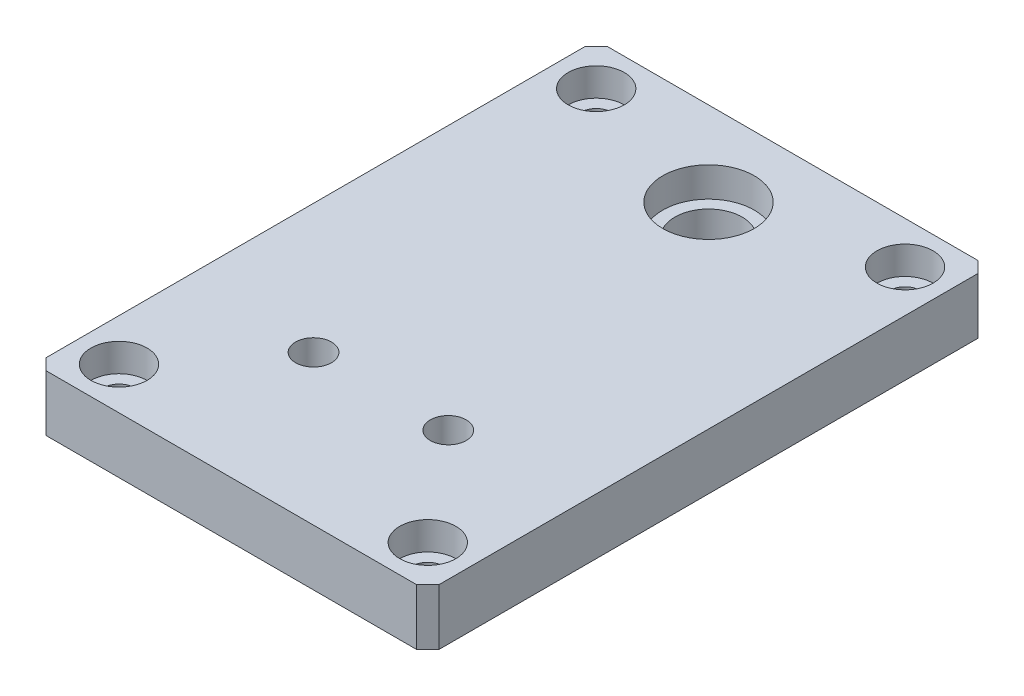
ISO-10303-21;
HEADER;
FILE_DESCRIPTION(('STEP AP214'),'2;1');
FILE_NAME('part.step','',(''),(''),'','','');
FILE_SCHEMA(('AUTOMOTIVE_DESIGN { 1 0 10303 214 1 1 1 1 }'));
ENDSEC;
DATA;
#1=APPLICATION_CONTEXT('core data for automotive mechanical design processes');
#2=APPLICATION_PROTOCOL_DEFINITION('international standard','automotive_design',2000,#1);
#3=PRODUCT_CONTEXT('',#1,'mechanical');
#4=PRODUCT('Part','Part','',(#3));
#5=PRODUCT_RELATED_PRODUCT_CATEGORY('part','',(#4));
#6=PRODUCT_DEFINITION_FORMATION('','',#4);
#7=PRODUCT_DEFINITION_CONTEXT('part definition',#1,'design');
#8=PRODUCT_DEFINITION('design','',#6,#7);
#9=PRODUCT_DEFINITION_SHAPE('','',#8);
#10=(LENGTH_UNIT() NAMED_UNIT(*) SI_UNIT(.MILLI.,.METRE.));
#11=(NAMED_UNIT(*) PLANE_ANGLE_UNIT() SI_UNIT($,.RADIAN.));
#12=(NAMED_UNIT(*) SI_UNIT($,.STERADIAN.) SOLID_ANGLE_UNIT());
#13=UNCERTAINTY_MEASURE_WITH_UNIT(LENGTH_MEASURE(1.E-05),#10,'distance_accuracy_value','');
#14=(GEOMETRIC_REPRESENTATION_CONTEXT(3) GLOBAL_UNCERTAINTY_ASSIGNED_CONTEXT((#13)) GLOBAL_UNIT_ASSIGNED_CONTEXT((#10,
#11,#12)) REPRESENTATION_CONTEXT('',''));
#15=CARTESIAN_POINT('',(0.,0.,0.));
#16=DIRECTION('',(0.,0.,1.));
#17=DIRECTION('',(1.,0.,0.));
#18=AXIS2_PLACEMENT_3D('',#15,#16,#17);
#19=CARTESIAN_POINT('',(35.,10.,50.));
#20=DIRECTION('',(-1.,0.,0.));
#21=DIRECTION('',(0.,0.,1.));
#22=AXIS2_PLACEMENT_3D('',#19,#20,#21);
#23=PLANE('',#22);
#24=DIRECTION('',(0.,0.,-1.));
#25=VECTOR('',#24,1.);
#26=CARTESIAN_POINT('',(35.,10.,50.));
#27=LINE('',#26,#25);
#28=CARTESIAN_POINT('',(35.,10.,48.));
#29=VERTEX_POINT('',#28);
#30=CARTESIAN_POINT('',(35.,10.,-48.));
#31=VERTEX_POINT('',#30);
#32=EDGE_CURVE('E131',#29,#31,#27,.T.);
#33=ORIENTED_EDGE('',*,*,#32,.F.);
#34=DIRECTION('',(0.,-1.,0.));
#35=VECTOR('',#34,1.);
#36=CARTESIAN_POINT('',(35.,10.,48.));
#37=LINE('',#36,#35);
#38=CARTESIAN_POINT('',(35.,0.,48.));
#39=VERTEX_POINT('',#38);
#40=EDGE_CURVE('E116',#29,#39,#37,.T.);
#41=ORIENTED_EDGE('',*,*,#40,.T.);
#42=DIRECTION('',(0.,0.,-1.));
#43=VECTOR('',#42,1.);
#44=CARTESIAN_POINT('',(35.,0.,50.));
#45=LINE('',#44,#43);
#46=CARTESIAN_POINT('',(35.,0.,-48.));
#47=VERTEX_POINT('',#46);
#48=EDGE_CURVE('E128',#39,#47,#45,.T.);
#49=ORIENTED_EDGE('',*,*,#48,.T.);
#50=DIRECTION('',(0.,1.,0.));
#51=VECTOR('',#50,1.);
#52=CARTESIAN_POINT('',(35.,10.,-48.));
#53=LINE('',#52,#51);
#54=EDGE_CURVE('E133',#47,#31,#53,.T.);
#55=ORIENTED_EDGE('',*,*,#54,.T.);
#56=EDGE_LOOP('',(#33,#41,#49,#55));
#57=FACE_BOUND('',#56,.T.);
#58=ADVANCED_FACE('F45',(#57),#23,.F.);
#59=CARTESIAN_POINT('',(-35.,10.,-50.));
#60=DIRECTION('',(0.,0.,1.));
#61=DIRECTION('',(1.,0.,0.));
#62=AXIS2_PLACEMENT_3D('',#59,#60,#61);
#63=PLANE('',#62);
#64=DIRECTION('',(-1.,0.,0.));
#65=VECTOR('',#64,1.);
#66=CARTESIAN_POINT('',(-35.,10.,-50.));
#67=LINE('',#66,#65);
#68=CARTESIAN_POINT('',(33.,10.,-50.));
#69=VERTEX_POINT('',#68);
#70=CARTESIAN_POINT('',(-33.,10.,-50.));
#71=VERTEX_POINT('',#70);
#72=EDGE_CURVE('E177',#69,#71,#67,.T.);
#73=ORIENTED_EDGE('',*,*,#72,.F.);
#74=DIRECTION('',(0.,-1.,0.));
#75=VECTOR('',#74,1.);
#76=CARTESIAN_POINT('',(33.,10.,-50.));
#77=LINE('',#76,#75);
#78=CARTESIAN_POINT('',(33.,0.,-50.));
#79=VERTEX_POINT('',#78);
#80=EDGE_CURVE('E170',#69,#79,#77,.T.);
#81=ORIENTED_EDGE('',*,*,#80,.T.);
#82=DIRECTION('',(-1.,0.,0.));
#83=VECTOR('',#82,1.);
#84=CARTESIAN_POINT('',(-35.,0.,-50.));
#85=LINE('',#84,#83);
#86=CARTESIAN_POINT('',(-33.,0.,-50.));
#87=VERTEX_POINT('',#86);
#88=EDGE_CURVE('E137',#79,#87,#85,.T.);
#89=ORIENTED_EDGE('',*,*,#88,.T.);
#90=DIRECTION('',(0.,1.,0.));
#91=VECTOR('',#90,1.);
#92=CARTESIAN_POINT('',(-33.,10.,-50.));
#93=LINE('',#92,#91);
#94=EDGE_CURVE('E168',#87,#71,#93,.T.);
#95=ORIENTED_EDGE('',*,*,#94,.T.);
#96=EDGE_LOOP('',(#73,#81,#89,#95));
#97=FACE_BOUND('',#96,.T.);
#98=ADVANCED_FACE('F175',(#97),#63,.F.);
#99=CARTESIAN_POINT('',(-35.,10.,50.));
#100=DIRECTION('',(1.,0.,0.));
#101=DIRECTION('',(0.,0.,-1.));
#102=AXIS2_PLACEMENT_3D('',#99,#100,#101);
#103=PLANE('',#102);
#104=DIRECTION('',(0.,0.,1.));
#105=VECTOR('',#104,1.);
#106=CARTESIAN_POINT('',(-35.,10.,50.));
#107=LINE('',#106,#105);
#108=CARTESIAN_POINT('',(-35.,10.,-48.));
#109=VERTEX_POINT('',#108);
#110=CARTESIAN_POINT('',(-35.,10.,48.));
#111=VERTEX_POINT('',#110);
#112=EDGE_CURVE('E185',#109,#111,#107,.T.);
#113=ORIENTED_EDGE('',*,*,#112,.F.);
#114=DIRECTION('',(0.,-1.,0.));
#115=VECTOR('',#114,1.);
#116=CARTESIAN_POINT('',(-35.,10.,-48.));
#117=LINE('',#116,#115);
#118=CARTESIAN_POINT('',(-35.,0.,-48.));
#119=VERTEX_POINT('',#118);
#120=EDGE_CURVE('E11',#109,#119,#117,.T.);
#121=ORIENTED_EDGE('',*,*,#120,.T.);
#122=DIRECTION('',(0.,0.,1.));
#123=VECTOR('',#122,1.);
#124=CARTESIAN_POINT('',(-35.,0.,50.));
#125=LINE('',#124,#123);
#126=CARTESIAN_POINT('',(-35.,0.,48.));
#127=VERTEX_POINT('',#126);
#128=EDGE_CURVE('E141',#119,#127,#125,.T.);
#129=ORIENTED_EDGE('',*,*,#128,.T.);
#130=DIRECTION('',(0.,1.,0.));
#131=VECTOR('',#130,1.);
#132=CARTESIAN_POINT('',(-35.,10.,48.));
#133=LINE('',#132,#131);
#134=EDGE_CURVE('E54',#127,#111,#133,.T.);
#135=ORIENTED_EDGE('',*,*,#134,.T.);
#136=EDGE_LOOP('',(#113,#121,#129,#135));
#137=FACE_BOUND('',#136,.T.);
#138=ADVANCED_FACE('F184',(#137),#103,.F.);
#139=CARTESIAN_POINT('',(-35.,10.,50.));
#140=DIRECTION('',(0.,0.,-1.));
#141=DIRECTION('',(-1.,0.,0.));
#142=AXIS2_PLACEMENT_3D('',#139,#140,#141);
#143=PLANE('',#142);
#144=DIRECTION('',(1.,0.,0.));
#145=VECTOR('',#144,1.);
#146=CARTESIAN_POINT('',(-35.,0.,50.));
#147=LINE('',#146,#145);
#148=CARTESIAN_POINT('',(-33.,0.,50.));
#149=VERTEX_POINT('',#148);
#150=CARTESIAN_POINT('',(33.,0.,50.));
#151=VERTEX_POINT('',#150);
#152=EDGE_CURVE('E151',#149,#151,#147,.T.);
#153=ORIENTED_EDGE('',*,*,#152,.T.);
#154=DIRECTION('',(0.,1.,0.));
#155=VECTOR('',#154,1.);
#156=CARTESIAN_POINT('',(33.,10.,50.));
#157=LINE('',#156,#155);
#158=CARTESIAN_POINT('',(33.,10.,50.));
#159=VERTEX_POINT('',#158);
#160=EDGE_CURVE('E117',#151,#159,#157,.T.);
#161=ORIENTED_EDGE('',*,*,#160,.T.);
#162=DIRECTION('',(1.,0.,0.));
#163=VECTOR('',#162,1.);
#164=CARTESIAN_POINT('',(-35.,10.,50.));
#165=LINE('',#164,#163);
#166=CARTESIAN_POINT('',(-33.,10.,50.));
#167=VERTEX_POINT('',#166);
#168=EDGE_CURVE('E147',#167,#159,#165,.T.);
#169=ORIENTED_EDGE('',*,*,#168,.F.);
#170=DIRECTION('',(0.,-1.,0.));
#171=VECTOR('',#170,1.);
#172=CARTESIAN_POINT('',(-33.,10.,50.));
#173=LINE('',#172,#171);
#174=EDGE_CURVE('E122',#167,#149,#173,.T.);
#175=ORIENTED_EDGE('',*,*,#174,.T.);
#176=EDGE_LOOP('',(#153,#161,#169,#175));
#177=FACE_BOUND('',#176,.T.);
#178=ADVANCED_FACE('F272',(#177),#143,.F.);
#179=CARTESIAN_POINT('',(0.,10.,0.));
#180=DIRECTION('',(0.,-1.,0.));
#181=DIRECTION('',(0.,0.,-1.));
#182=AXIS2_PLACEMENT_3D('',#179,#180,#181);
#183=PLANE('',#182);
#184=CARTESIAN_POINT('',(12.,10.,23.35));
#185=DIRECTION('',(0.,1.,0.));
#186=DIRECTION('',(0.,0.,1.));
#187=AXIS2_PLACEMENT_3D('',#184,#185,#186);
#188=CIRCLE('',#187,3.2);
#189=CARTESIAN_POINT('',(12.,10.,26.55));
#190=VERTEX_POINT('',#189);
#191=EDGE_CURVE('E254',#190,#190,#188,.T.);
#192=ORIENTED_EDGE('',*,*,#191,.F.);
#193=EDGE_LOOP('',(#192));
#194=FACE_BOUND('',#193,.T.);
#195=CARTESIAN_POINT('',(-12.,10.,23.35));
#196=DIRECTION('',(0.,1.,0.));
#197=DIRECTION('',(0.,0.,1.));
#198=AXIS2_PLACEMENT_3D('',#195,#196,#197);
#199=CIRCLE('',#198,3.2);
#200=CARTESIAN_POINT('',(-12.,10.,26.55));
#201=VERTEX_POINT('',#200);
#202=EDGE_CURVE('E251',#201,#201,#199,.T.);
#203=ORIENTED_EDGE('',*,*,#202,.F.);
#204=EDGE_LOOP('',(#203));
#205=FACE_BOUND('',#204,.T.);
#206=CARTESIAN_POINT('',(0.,10.,-35.));
#207=DIRECTION('',(0.,1.,0.));
#208=DIRECTION('',(0.,0.,1.));
#209=AXIS2_PLACEMENT_3D('',#206,#207,#208);
#210=CIRCLE('',#209,8.14999999999999);
#211=CARTESIAN_POINT('',(0.,10.,-26.85));
#212=VERTEX_POINT('',#211);
#213=EDGE_CURVE('E238',#212,#212,#210,.T.);
#214=ORIENTED_EDGE('',*,*,#213,.F.);
#215=EDGE_LOOP('',(#214));
#216=FACE_BOUND('',#215,.T.);
#217=CARTESIAN_POINT('',(-27.5,10.,42.5));
#218=DIRECTION('',(0.,1.,0.));
#219=DIRECTION('',(0.,0.,1.));
#220=AXIS2_PLACEMENT_3D('',#217,#218,#219);
#221=CIRCLE('',#220,5.);
#222=CARTESIAN_POINT('',(-27.5,10.,47.5));
#223=VERTEX_POINT('',#222);
#224=EDGE_CURVE('E232',#223,#223,#221,.T.);
#225=ORIENTED_EDGE('',*,*,#224,.F.);
#226=EDGE_LOOP('',(#225));
#227=FACE_BOUND('',#226,.T.);
#228=CARTESIAN_POINT('',(-27.5,10.,-42.5));
#229=DIRECTION('',(0.,1.,0.));
#230=DIRECTION('',(0.,0.,1.));
#231=AXIS2_PLACEMENT_3D('',#228,#229,#230);
#232=CIRCLE('',#231,5.);
#233=CARTESIAN_POINT('',(-27.5,10.,-37.5));
#234=VERTEX_POINT('',#233);
#235=EDGE_CURVE('E220',#234,#234,#232,.T.);
#236=ORIENTED_EDGE('',*,*,#235,.F.);
#237=EDGE_LOOP('',(#236));
#238=FACE_BOUND('',#237,.T.);
#239=CARTESIAN_POINT('',(27.5,10.,-42.5));
#240=DIRECTION('',(0.,1.,0.));
#241=DIRECTION('',(0.,0.,1.));
#242=AXIS2_PLACEMENT_3D('',#239,#240,#241);
#243=CIRCLE('',#242,5.);
#244=CARTESIAN_POINT('',(27.5,10.,-37.5));
#245=VERTEX_POINT('',#244);
#246=EDGE_CURVE('E208',#245,#245,#243,.T.);
#247=ORIENTED_EDGE('',*,*,#246,.F.);
#248=EDGE_LOOP('',(#247));
#249=FACE_BOUND('',#248,.T.);
#250=CARTESIAN_POINT('',(27.5,10.,42.5));
#251=DIRECTION('',(0.,1.,0.));
#252=DIRECTION('',(0.,0.,1.));
#253=AXIS2_PLACEMENT_3D('',#250,#251,#252);
#254=CIRCLE('',#253,5.);
#255=CARTESIAN_POINT('',(27.5,10.,47.5));
#256=VERTEX_POINT('',#255);
#257=EDGE_CURVE('E196',#256,#256,#254,.T.);
#258=ORIENTED_EDGE('',*,*,#257,.F.);
#259=EDGE_LOOP('',(#258));
#260=FACE_BOUND('',#259,.T.);
#261=ORIENTED_EDGE('',*,*,#168,.T.);
#262=DIRECTION('',(-0.707106781186548,0.,0.707106781186548));
#263=VECTOR('',#262,1.);
#264=CARTESIAN_POINT('',(35.,10.,48.));
#265=LINE('',#264,#263);
#266=EDGE_CURVE('E166',#159,#29,#265,.F.);
#267=ORIENTED_EDGE('',*,*,#266,.T.);
#268=ORIENTED_EDGE('',*,*,#32,.T.);
#269=DIRECTION('',(0.707106781186548,0.,0.707106781186548));
#270=VECTOR('',#269,1.);
#271=CARTESIAN_POINT('',(33.,10.,-50.));
#272=LINE('',#271,#270);
#273=EDGE_CURVE('E164',#31,#69,#272,.F.);
#274=ORIENTED_EDGE('',*,*,#273,.T.);
#275=ORIENTED_EDGE('',*,*,#72,.T.);
#276=DIRECTION('',(0.707106781186548,0.,-0.707106781186548));
#277=VECTOR('',#276,1.);
#278=CARTESIAN_POINT('',(-35.,10.,-48.));
#279=LINE('',#278,#277);
#280=EDGE_CURVE('E67',#71,#109,#279,.F.);
#281=ORIENTED_EDGE('',*,*,#280,.T.);
#282=ORIENTED_EDGE('',*,*,#112,.T.);
#283=DIRECTION('',(-0.707106781186548,0.,-0.707106781186548));
#284=VECTOR('',#283,1.);
#285=CARTESIAN_POINT('',(-33.,10.,50.));
#286=LINE('',#285,#284);
#287=EDGE_CURVE('E161',#111,#167,#286,.F.);
#288=ORIENTED_EDGE('',*,*,#287,.T.);
#289=EDGE_LOOP('',(#261,#267,#268,#274,#275,#281,#282,#288));
#290=FACE_BOUND('',#289,.T.);
#291=ADVANCED_FACE('F269',(#194,#205,#216,#227,#238,#249,#260,#290),#183,.F.);
#292=CARTESIAN_POINT('',(0.,0.,0.));
#293=DIRECTION('',(0.,-1.,0.));
#294=DIRECTION('',(0.,0.,-1.));
#295=AXIS2_PLACEMENT_3D('',#292,#293,#294);
#296=PLANE('',#295);
#297=CARTESIAN_POINT('',(12.,0.,23.35));
#298=DIRECTION('',(0.,1.,0.));
#299=DIRECTION('',(0.,0.,1.));
#300=AXIS2_PLACEMENT_3D('',#297,#298,#299);
#301=CIRCLE('',#300,3.2);
#302=CARTESIAN_POINT('',(12.,0.,26.55));
#303=VERTEX_POINT('',#302);
#304=EDGE_CURVE('E247',#303,#303,#301,.T.);
#305=ORIENTED_EDGE('',*,*,#304,.T.);
#306=EDGE_LOOP('',(#305));
#307=FACE_BOUND('',#306,.T.);
#308=CARTESIAN_POINT('',(-12.,0.,23.35));
#309=DIRECTION('',(0.,1.,0.));
#310=DIRECTION('',(0.,0.,1.));
#311=AXIS2_PLACEMENT_3D('',#308,#309,#310);
#312=CIRCLE('',#311,3.2);
#313=CARTESIAN_POINT('',(-12.,0.,26.55));
#314=VERTEX_POINT('',#313);
#315=EDGE_CURVE('E248',#314,#314,#312,.T.);
#316=ORIENTED_EDGE('',*,*,#315,.T.);
#317=EDGE_LOOP('',(#316));
#318=FACE_BOUND('',#317,.T.);
#319=CARTESIAN_POINT('',(0.,0.,-35.));
#320=DIRECTION('',(0.,1.,0.));
#321=DIRECTION('',(0.,0.,1.));
#322=AXIS2_PLACEMENT_3D('',#319,#320,#321);
#323=CIRCLE('',#322,6.);
#324=CARTESIAN_POINT('',(0.,0.,-29.));
#325=VERTEX_POINT('',#324);
#326=EDGE_CURVE('E241',#325,#325,#323,.T.);
#327=ORIENTED_EDGE('',*,*,#326,.T.);
#328=EDGE_LOOP('',(#327));
#329=FACE_BOUND('',#328,.T.);
#330=CARTESIAN_POINT('',(-27.5,0.,42.5));
#331=DIRECTION('',(0.,1.,0.));
#332=DIRECTION('',(0.,0.,1.));
#333=AXIS2_PLACEMENT_3D('',#330,#331,#332);
#334=CIRCLE('',#333,2.75000000000001);
#335=CARTESIAN_POINT('',(-27.5,0.,45.25));
#336=VERTEX_POINT('',#335);
#337=EDGE_CURVE('E223',#336,#336,#334,.T.);
#338=ORIENTED_EDGE('',*,*,#337,.T.);
#339=EDGE_LOOP('',(#338));
#340=FACE_BOUND('',#339,.T.);
#341=CARTESIAN_POINT('',(-27.5,0.,-42.5));
#342=DIRECTION('',(0.,1.,0.));
#343=DIRECTION('',(0.,0.,1.));
#344=AXIS2_PLACEMENT_3D('',#341,#342,#343);
#345=CIRCLE('',#344,2.75000000000001);
#346=CARTESIAN_POINT('',(-27.5,0.,-39.75));
#347=VERTEX_POINT('',#346);
#348=EDGE_CURVE('E211',#347,#347,#345,.T.);
#349=ORIENTED_EDGE('',*,*,#348,.T.);
#350=EDGE_LOOP('',(#349));
#351=FACE_BOUND('',#350,.T.);
#352=CARTESIAN_POINT('',(27.5,0.,-42.5));
#353=DIRECTION('',(0.,1.,0.));
#354=DIRECTION('',(0.,0.,1.));
#355=AXIS2_PLACEMENT_3D('',#352,#353,#354);
#356=CIRCLE('',#355,2.75000000000001);
#357=CARTESIAN_POINT('',(27.5,0.,-39.75));
#358=VERTEX_POINT('',#357);
#359=EDGE_CURVE('E199',#358,#358,#356,.T.);
#360=ORIENTED_EDGE('',*,*,#359,.T.);
#361=EDGE_LOOP('',(#360));
#362=FACE_BOUND('',#361,.T.);
#363=CARTESIAN_POINT('',(27.5,0.,42.5));
#364=DIRECTION('',(0.,1.,0.));
#365=DIRECTION('',(0.,0.,1.));
#366=AXIS2_PLACEMENT_3D('',#363,#364,#365);
#367=CIRCLE('',#366,2.75000000000001);
#368=CARTESIAN_POINT('',(27.5,0.,45.25));
#369=VERTEX_POINT('',#368);
#370=EDGE_CURVE('E138',#369,#369,#367,.T.);
#371=ORIENTED_EDGE('',*,*,#370,.T.);
#372=EDGE_LOOP('',(#371));
#373=FACE_BOUND('',#372,.T.);
#374=ORIENTED_EDGE('',*,*,#48,.F.);
#375=DIRECTION('',(0.707106781186548,0.,-0.707106781186548));
#376=VECTOR('',#375,1.);
#377=CARTESIAN_POINT('',(41.5,0.,41.5));
#378=LINE('',#377,#376);
#379=EDGE_CURVE('E112',#39,#151,#378,.F.);
#380=ORIENTED_EDGE('',*,*,#379,.T.);
#381=ORIENTED_EDGE('',*,*,#152,.F.);
#382=DIRECTION('',(0.707106781186548,0.,0.707106781186548));
#383=VECTOR('',#382,1.);
#384=CARTESIAN_POINT('',(-41.5,0.,41.5));
#385=LINE('',#384,#383);
#386=EDGE_CURVE('E132',#149,#127,#385,.F.);
#387=ORIENTED_EDGE('',*,*,#386,.T.);
#388=ORIENTED_EDGE('',*,*,#128,.F.);
#389=DIRECTION('',(-0.707106781186548,0.,0.707106781186548));
#390=VECTOR('',#389,1.);
#391=CARTESIAN_POINT('',(-41.5,0.,-41.5));
#392=LINE('',#391,#390);
#393=EDGE_CURVE('E155',#119,#87,#392,.F.);
#394=ORIENTED_EDGE('',*,*,#393,.T.);
#395=ORIENTED_EDGE('',*,*,#88,.F.);
#396=DIRECTION('',(-0.707106781186548,0.,-0.707106781186548));
#397=VECTOR('',#396,1.);
#398=CARTESIAN_POINT('',(41.5,0.,-41.5));
#399=LINE('',#398,#397);
#400=EDGE_CURVE('E123',#79,#47,#399,.F.);
#401=ORIENTED_EDGE('',*,*,#400,.T.);
#402=EDGE_LOOP('',(#374,#380,#381,#387,#388,#394,#395,#401));
#403=FACE_BOUND('',#402,.T.);
#404=ADVANCED_FACE('F135',(#307,#318,#329,#340,#351,#362,#373,#403),#296,.T.);
#405=CARTESIAN_POINT('',(27.5,10.,42.5));
#406=DIRECTION('',(0.,1.,0.));
#407=DIRECTION('',(0.,0.,1.));
#408=AXIS2_PLACEMENT_3D('',#405,#406,#407);
#409=CYLINDRICAL_SURFACE('',#408,2.75);
#410=ORIENTED_EDGE('',*,*,#370,.F.);
#411=EDGE_LOOP('',(#410));
#412=FACE_BOUND('',#411,.T.);
#413=CARTESIAN_POINT('',(27.5,5.,42.5));
#414=DIRECTION('',(0.,1.,0.));
#415=DIRECTION('',(0.,0.,1.));
#416=AXIS2_PLACEMENT_3D('',#413,#414,#415);
#417=CIRCLE('',#416,2.75);
#418=CARTESIAN_POINT('',(27.5,5.,45.25));
#419=VERTEX_POINT('',#418);
#420=EDGE_CURVE('E144',#419,#419,#417,.T.);
#421=ORIENTED_EDGE('',*,*,#420,.T.);
#422=EDGE_LOOP('',(#421));
#423=FACE_BOUND('',#422,.T.);
#424=ADVANCED_FACE('F475',(#412,#423),#409,.F.);
#425=CARTESIAN_POINT('',(30.25,5.,42.5));
#426=DIRECTION('',(0.,-1.,0.));
#427=DIRECTION('',(0.,0.,-1.));
#428=AXIS2_PLACEMENT_3D('',#425,#426,#427);
#429=PLANE('',#428);
#430=ORIENTED_EDGE('',*,*,#420,.F.);
#431=EDGE_LOOP('',(#430));
#432=FACE_BOUND('',#431,.T.);
#433=CARTESIAN_POINT('',(27.5,5.,42.5));
#434=DIRECTION('',(0.,1.,0.));
#435=DIRECTION('',(0.,0.,1.));
#436=AXIS2_PLACEMENT_3D('',#433,#434,#435);
#437=CIRCLE('',#436,5.);
#438=CARTESIAN_POINT('',(27.5,5.,47.5));
#439=VERTEX_POINT('',#438);
#440=EDGE_CURVE('E193',#439,#439,#437,.T.);
#441=ORIENTED_EDGE('',*,*,#440,.T.);
#442=EDGE_LOOP('',(#441));
#443=FACE_BOUND('',#442,.T.);
#444=ADVANCED_FACE('F466',(#432,#443),#429,.F.);
#445=CARTESIAN_POINT('',(27.5,10.,42.5));
#446=DIRECTION('',(0.,1.,0.));
#447=DIRECTION('',(0.,0.,1.));
#448=AXIS2_PLACEMENT_3D('',#445,#446,#447);
#449=CYLINDRICAL_SURFACE('',#448,5.);
#450=ORIENTED_EDGE('',*,*,#440,.F.);
#451=EDGE_LOOP('',(#450));
#452=FACE_BOUND('',#451,.T.);
#453=ORIENTED_EDGE('',*,*,#257,.T.);
#454=EDGE_LOOP('',(#453));
#455=FACE_BOUND('',#454,.T.);
#456=ADVANCED_FACE('F457',(#452,#455),#449,.F.);
#457=CARTESIAN_POINT('',(27.5,10.,-42.5));
#458=DIRECTION('',(0.,1.,0.));
#459=DIRECTION('',(0.,0.,1.));
#460=AXIS2_PLACEMENT_3D('',#457,#458,#459);
#461=CYLINDRICAL_SURFACE('',#460,2.75);
#462=ORIENTED_EDGE('',*,*,#359,.F.);
#463=EDGE_LOOP('',(#462));
#464=FACE_BOUND('',#463,.T.);
#465=CARTESIAN_POINT('',(27.5,5.,-42.5));
#466=DIRECTION('',(0.,1.,0.));
#467=DIRECTION('',(0.,0.,1.));
#468=AXIS2_PLACEMENT_3D('',#465,#466,#467);
#469=CIRCLE('',#468,2.75);
#470=CARTESIAN_POINT('',(27.5,5.,-39.75));
#471=VERTEX_POINT('',#470);
#472=EDGE_CURVE('E202',#471,#471,#469,.T.);
#473=ORIENTED_EDGE('',*,*,#472,.T.);
#474=EDGE_LOOP('',(#473));
#475=FACE_BOUND('',#474,.T.);
#476=ADVANCED_FACE('F448',(#464,#475),#461,.F.);
#477=CARTESIAN_POINT('',(30.25,5.,-42.5));
#478=DIRECTION('',(0.,-1.,0.));
#479=DIRECTION('',(0.,0.,-1.));
#480=AXIS2_PLACEMENT_3D('',#477,#478,#479);
#481=PLANE('',#480);
#482=ORIENTED_EDGE('',*,*,#472,.F.);
#483=EDGE_LOOP('',(#482));
#484=FACE_BOUND('',#483,.T.);
#485=CARTESIAN_POINT('',(27.5,5.,-42.5));
#486=DIRECTION('',(0.,1.,0.));
#487=DIRECTION('',(0.,0.,1.));
#488=AXIS2_PLACEMENT_3D('',#485,#486,#487);
#489=CIRCLE('',#488,5.);
#490=CARTESIAN_POINT('',(27.5,5.,-37.5));
#491=VERTEX_POINT('',#490);
#492=EDGE_CURVE('E205',#491,#491,#489,.T.);
#493=ORIENTED_EDGE('',*,*,#492,.T.);
#494=EDGE_LOOP('',(#493));
#495=FACE_BOUND('',#494,.T.);
#496=ADVANCED_FACE('F439',(#484,#495),#481,.F.);
#497=CARTESIAN_POINT('',(27.5,10.,-42.5));
#498=DIRECTION('',(0.,1.,0.));
#499=DIRECTION('',(0.,0.,1.));
#500=AXIS2_PLACEMENT_3D('',#497,#498,#499);
#501=CYLINDRICAL_SURFACE('',#500,5.);
#502=ORIENTED_EDGE('',*,*,#492,.F.);
#503=EDGE_LOOP('',(#502));
#504=FACE_BOUND('',#503,.T.);
#505=ORIENTED_EDGE('',*,*,#246,.T.);
#506=EDGE_LOOP('',(#505));
#507=FACE_BOUND('',#506,.T.);
#508=ADVANCED_FACE('F430',(#504,#507),#501,.F.);
#509=CARTESIAN_POINT('',(-27.5,10.,-42.5));
#510=DIRECTION('',(0.,1.,0.));
#511=DIRECTION('',(0.,0.,1.));
#512=AXIS2_PLACEMENT_3D('',#509,#510,#511);
#513=CYLINDRICAL_SURFACE('',#512,2.75);
#514=ORIENTED_EDGE('',*,*,#348,.F.);
#515=EDGE_LOOP('',(#514));
#516=FACE_BOUND('',#515,.T.);
#517=CARTESIAN_POINT('',(-27.5,5.,-42.5));
#518=DIRECTION('',(0.,1.,0.));
#519=DIRECTION('',(0.,0.,1.));
#520=AXIS2_PLACEMENT_3D('',#517,#518,#519);
#521=CIRCLE('',#520,2.75);
#522=CARTESIAN_POINT('',(-27.5,5.,-39.75));
#523=VERTEX_POINT('',#522);
#524=EDGE_CURVE('E214',#523,#523,#521,.T.);
#525=ORIENTED_EDGE('',*,*,#524,.T.);
#526=EDGE_LOOP('',(#525));
#527=FACE_BOUND('',#526,.T.);
#528=ADVANCED_FACE('F421',(#516,#527),#513,.F.);
#529=CARTESIAN_POINT('',(-24.75,5.,-42.5));
#530=DIRECTION('',(0.,-1.,0.));
#531=DIRECTION('',(0.,0.,-1.));
#532=AXIS2_PLACEMENT_3D('',#529,#530,#531);
#533=PLANE('',#532);
#534=ORIENTED_EDGE('',*,*,#524,.F.);
#535=EDGE_LOOP('',(#534));
#536=FACE_BOUND('',#535,.T.);
#537=CARTESIAN_POINT('',(-27.5,5.,-42.5));
#538=DIRECTION('',(0.,1.,0.));
#539=DIRECTION('',(0.,0.,1.));
#540=AXIS2_PLACEMENT_3D('',#537,#538,#539);
#541=CIRCLE('',#540,5.);
#542=CARTESIAN_POINT('',(-27.5,5.,-37.5));
#543=VERTEX_POINT('',#542);
#544=EDGE_CURVE('E217',#543,#543,#541,.T.);
#545=ORIENTED_EDGE('',*,*,#544,.T.);
#546=EDGE_LOOP('',(#545));
#547=FACE_BOUND('',#546,.T.);
#548=ADVANCED_FACE('F412',(#536,#547),#533,.F.);
#549=CARTESIAN_POINT('',(-27.5,10.,-42.5));
#550=DIRECTION('',(0.,1.,0.));
#551=DIRECTION('',(0.,0.,1.));
#552=AXIS2_PLACEMENT_3D('',#549,#550,#551);
#553=CYLINDRICAL_SURFACE('',#552,5.);
#554=ORIENTED_EDGE('',*,*,#544,.F.);
#555=EDGE_LOOP('',(#554));
#556=FACE_BOUND('',#555,.T.);
#557=ORIENTED_EDGE('',*,*,#235,.T.);
#558=EDGE_LOOP('',(#557));
#559=FACE_BOUND('',#558,.T.);
#560=ADVANCED_FACE('F403',(#556,#559),#553,.F.);
#561=CARTESIAN_POINT('',(-27.5,10.,42.5));
#562=DIRECTION('',(0.,1.,0.));
#563=DIRECTION('',(0.,0.,1.));
#564=AXIS2_PLACEMENT_3D('',#561,#562,#563);
#565=CYLINDRICAL_SURFACE('',#564,2.75);
#566=ORIENTED_EDGE('',*,*,#337,.F.);
#567=EDGE_LOOP('',(#566));
#568=FACE_BOUND('',#567,.T.);
#569=CARTESIAN_POINT('',(-27.5,5.,42.5));
#570=DIRECTION('',(0.,1.,0.));
#571=DIRECTION('',(0.,0.,1.));
#572=AXIS2_PLACEMENT_3D('',#569,#570,#571);
#573=CIRCLE('',#572,2.75);
#574=CARTESIAN_POINT('',(-27.5,5.,45.25));
#575=VERTEX_POINT('',#574);
#576=EDGE_CURVE('E226',#575,#575,#573,.T.);
#577=ORIENTED_EDGE('',*,*,#576,.T.);
#578=EDGE_LOOP('',(#577));
#579=FACE_BOUND('',#578,.T.);
#580=ADVANCED_FACE('F394',(#568,#579),#565,.F.);
#581=CARTESIAN_POINT('',(-24.75,5.,42.5));
#582=DIRECTION('',(0.,-1.,0.));
#583=DIRECTION('',(0.,0.,-1.));
#584=AXIS2_PLACEMENT_3D('',#581,#582,#583);
#585=PLANE('',#584);
#586=ORIENTED_EDGE('',*,*,#576,.F.);
#587=EDGE_LOOP('',(#586));
#588=FACE_BOUND('',#587,.T.);
#589=CARTESIAN_POINT('',(-27.5,5.,42.5));
#590=DIRECTION('',(0.,1.,0.));
#591=DIRECTION('',(0.,0.,1.));
#592=AXIS2_PLACEMENT_3D('',#589,#590,#591);
#593=CIRCLE('',#592,5.);
#594=CARTESIAN_POINT('',(-27.5,5.,47.5));
#595=VERTEX_POINT('',#594);
#596=EDGE_CURVE('E229',#595,#595,#593,.T.);
#597=ORIENTED_EDGE('',*,*,#596,.T.);
#598=EDGE_LOOP('',(#597));
#599=FACE_BOUND('',#598,.T.);
#600=ADVANCED_FACE('F385',(#588,#599),#585,.F.);
#601=CARTESIAN_POINT('',(-27.5,10.,42.5));
#602=DIRECTION('',(0.,1.,0.));
#603=DIRECTION('',(0.,0.,1.));
#604=AXIS2_PLACEMENT_3D('',#601,#602,#603);
#605=CYLINDRICAL_SURFACE('',#604,5.);
#606=ORIENTED_EDGE('',*,*,#596,.F.);
#607=EDGE_LOOP('',(#606));
#608=FACE_BOUND('',#607,.T.);
#609=ORIENTED_EDGE('',*,*,#224,.T.);
#610=EDGE_LOOP('',(#609));
#611=FACE_BOUND('',#610,.T.);
#612=ADVANCED_FACE('F376',(#608,#611),#605,.F.);
#613=CARTESIAN_POINT('',(0.,4.7,-35.));
#614=DIRECTION('',(0.,-1.,0.));
#615=DIRECTION('',(0.,0.,-1.));
#616=AXIS2_PLACEMENT_3D('',#613,#614,#615);
#617=PLANE('',#616);
#618=CARTESIAN_POINT('',(0.,4.7,-35.));
#619=DIRECTION('',(0.,1.,0.));
#620=DIRECTION('',(0.,0.,1.));
#621=AXIS2_PLACEMENT_3D('',#618,#619,#620);
#622=CIRCLE('',#621,5.99999999999999);
#623=CARTESIAN_POINT('',(0.,4.7,-29.));
#624=VERTEX_POINT('',#623);
#625=EDGE_CURVE('E244',#624,#624,#622,.T.);
#626=ORIENTED_EDGE('',*,*,#625,.F.);
#627=EDGE_LOOP('',(#626));
#628=FACE_BOUND('',#627,.T.);
#629=CARTESIAN_POINT('',(0.,4.7,-35.));
#630=DIRECTION('',(0.,1.,0.));
#631=DIRECTION('',(0.,0.,1.));
#632=AXIS2_PLACEMENT_3D('',#629,#630,#631);
#633=CIRCLE('',#632,8.15);
#634=CARTESIAN_POINT('',(0.,4.7,-26.85));
#635=VERTEX_POINT('',#634);
#636=EDGE_CURVE('E235',#635,#635,#633,.T.);
#637=ORIENTED_EDGE('',*,*,#636,.T.);
#638=EDGE_LOOP('',(#637));
#639=FACE_BOUND('',#638,.T.);
#640=ADVANCED_FACE('F367',(#628,#639),#617,.F.);
#641=CARTESIAN_POINT('',(0.,10.,-35.));
#642=DIRECTION('',(0.,1.,0.));
#643=DIRECTION('',(0.,0.,1.));
#644=AXIS2_PLACEMENT_3D('',#641,#642,#643);
#645=CYLINDRICAL_SURFACE('',#644,8.14999999999999);
#646=ORIENTED_EDGE('',*,*,#636,.F.);
#647=EDGE_LOOP('',(#646));
#648=FACE_BOUND('',#647,.T.);
#649=ORIENTED_EDGE('',*,*,#213,.T.);
#650=EDGE_LOOP('',(#649));
#651=FACE_BOUND('',#650,.T.);
#652=ADVANCED_FACE('F358',(#648,#651),#645,.F.);
#653=CARTESIAN_POINT('',(0.,4.7,-35.));
#654=DIRECTION('',(0.,1.,0.));
#655=DIRECTION('',(0.,0.,1.));
#656=AXIS2_PLACEMENT_3D('',#653,#654,#655);
#657=CYLINDRICAL_SURFACE('',#656,5.99999999999999);
#658=ORIENTED_EDGE('',*,*,#326,.F.);
#659=EDGE_LOOP('',(#658));
#660=FACE_BOUND('',#659,.T.);
#661=ORIENTED_EDGE('',*,*,#625,.T.);
#662=EDGE_LOOP('',(#661));
#663=FACE_BOUND('',#662,.T.);
#664=ADVANCED_FACE('F349',(#660,#663),#657,.F.);
#665=CARTESIAN_POINT('',(-12.,0.,23.35));
#666=DIRECTION('',(0.,1.,0.));
#667=DIRECTION('',(0.,0.,1.));
#668=AXIS2_PLACEMENT_3D('',#665,#666,#667);
#669=CYLINDRICAL_SURFACE('',#668,3.2);
#670=ORIENTED_EDGE('',*,*,#315,.F.);
#671=EDGE_LOOP('',(#670));
#672=FACE_BOUND('',#671,.T.);
#673=ORIENTED_EDGE('',*,*,#202,.T.);
#674=EDGE_LOOP('',(#673));
#675=FACE_BOUND('',#674,.T.);
#676=ADVANCED_FACE('F265',(#672,#675),#669,.F.);
#677=CARTESIAN_POINT('',(12.,0.,23.35));
#678=DIRECTION('',(0.,1.,0.));
#679=DIRECTION('',(0.,0.,1.));
#680=AXIS2_PLACEMENT_3D('',#677,#678,#679);
#681=CYLINDRICAL_SURFACE('',#680,3.2);
#682=ORIENTED_EDGE('',*,*,#304,.F.);
#683=EDGE_LOOP('',(#682));
#684=FACE_BOUND('',#683,.T.);
#685=ORIENTED_EDGE('',*,*,#191,.T.);
#686=EDGE_LOOP('',(#685));
#687=FACE_BOUND('',#686,.T.);
#688=ADVANCED_FACE('F262',(#684,#687),#681,.F.);
#689=CARTESIAN_POINT('',(35.,10.,48.));
#690=DIRECTION('',(-0.707106781186547,0.,-0.707106781186547));
#691=DIRECTION('',(0.,-1.,0.));
#692=AXIS2_PLACEMENT_3D('',#689,#690,#691);
#693=PLANE('',#692);
#694=ORIENTED_EDGE('',*,*,#266,.F.);
#695=ORIENTED_EDGE('',*,*,#160,.F.);
#696=ORIENTED_EDGE('',*,*,#379,.F.);
#697=ORIENTED_EDGE('',*,*,#40,.F.);
#698=EDGE_LOOP('',(#694,#695,#696,#697));
#699=FACE_BOUND('',#698,.T.);
#700=ADVANCED_FACE('F115',(#699),#693,.F.);
#701=CARTESIAN_POINT('',(33.,10.,-50.));
#702=DIRECTION('',(-0.707106781186547,0.,0.707106781186547));
#703=DIRECTION('',(0.,-1.,0.));
#704=AXIS2_PLACEMENT_3D('',#701,#702,#703);
#705=PLANE('',#704);
#706=ORIENTED_EDGE('',*,*,#273,.F.);
#707=ORIENTED_EDGE('',*,*,#54,.F.);
#708=ORIENTED_EDGE('',*,*,#400,.F.);
#709=ORIENTED_EDGE('',*,*,#80,.F.);
#710=EDGE_LOOP('',(#706,#707,#708,#709));
#711=FACE_BOUND('',#710,.T.);
#712=ADVANCED_FACE('F293',(#711),#705,.F.);
#713=CARTESIAN_POINT('',(-35.,10.,-48.));
#714=DIRECTION('',(0.707106781186547,0.,0.707106781186547));
#715=DIRECTION('',(0.,-1.,0.));
#716=AXIS2_PLACEMENT_3D('',#713,#714,#715);
#717=PLANE('',#716);
#718=ORIENTED_EDGE('',*,*,#280,.F.);
#719=ORIENTED_EDGE('',*,*,#94,.F.);
#720=ORIENTED_EDGE('',*,*,#393,.F.);
#721=ORIENTED_EDGE('',*,*,#120,.F.);
#722=EDGE_LOOP('',(#718,#719,#720,#721));
#723=FACE_BOUND('',#722,.T.);
#724=ADVANCED_FACE('F183',(#723),#717,.F.);
#725=CARTESIAN_POINT('',(-33.,10.,50.));
#726=DIRECTION('',(0.707106781186547,0.,-0.707106781186547));
#727=DIRECTION('',(0.,-1.,0.));
#728=AXIS2_PLACEMENT_3D('',#725,#726,#727);
#729=PLANE('',#728);
#730=ORIENTED_EDGE('',*,*,#287,.F.);
#731=ORIENTED_EDGE('',*,*,#134,.F.);
#732=ORIENTED_EDGE('',*,*,#386,.F.);
#733=ORIENTED_EDGE('',*,*,#174,.F.);
#734=EDGE_LOOP('',(#730,#731,#732,#733));
#735=FACE_BOUND('',#734,.T.);
#736=ADVANCED_FACE('F48',(#735),#729,.F.);
#737=CLOSED_SHELL('',(#58,#98,#138,#178,#291,#404,#424,#444,#456,#476,#496,#508,#528,#548,#560,
#580,#600,#612,#640,#652,#664,#676,#688,#700,#712,#724,#736));
#738=MANIFOLD_SOLID_BREP('B2',#737);
#739=ADVANCED_BREP_SHAPE_REPRESENTATION('',(#18,#738),#14);
#740=SHAPE_DEFINITION_REPRESENTATION(#9,#739);
ENDSEC;
END-ISO-10303-21;
